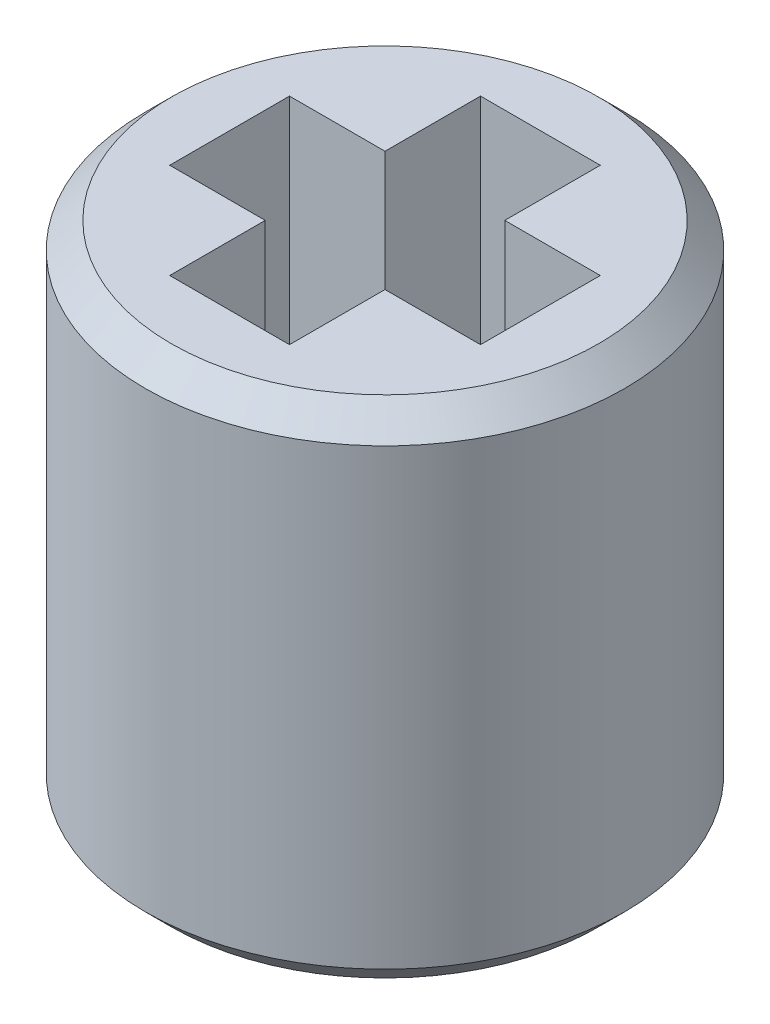
ISO-10303-21;
HEADER;
FILE_DESCRIPTION(('STEP AP214'),'2;1');
FILE_NAME('part.step','',(''),(''),'','','');
FILE_SCHEMA(('AUTOMOTIVE_DESIGN { 1 0 10303 214 1 1 1 1 }'));
ENDSEC;
DATA;
#1=APPLICATION_CONTEXT('core data for automotive mechanical design processes');
#2=APPLICATION_PROTOCOL_DEFINITION('international standard','automotive_design',2000,#1);
#3=PRODUCT_CONTEXT('',#1,'mechanical');
#4=PRODUCT('Part','Part','',(#3));
#5=PRODUCT_RELATED_PRODUCT_CATEGORY('part','',(#4));
#6=PRODUCT_DEFINITION_FORMATION('','',#4);
#7=PRODUCT_DEFINITION_CONTEXT('part definition',#1,'design');
#8=PRODUCT_DEFINITION('design','',#6,#7);
#9=PRODUCT_DEFINITION_SHAPE('','',#8);
#10=(LENGTH_UNIT() NAMED_UNIT(*) SI_UNIT(.MILLI.,.METRE.));
#11=(NAMED_UNIT(*) PLANE_ANGLE_UNIT() SI_UNIT($,.RADIAN.));
#12=(NAMED_UNIT(*) SI_UNIT($,.STERADIAN.) SOLID_ANGLE_UNIT());
#13=UNCERTAINTY_MEASURE_WITH_UNIT(LENGTH_MEASURE(1.E-05),#10,'distance_accuracy_value','');
#14=(GEOMETRIC_REPRESENTATION_CONTEXT(3) GLOBAL_UNCERTAINTY_ASSIGNED_CONTEXT((#13)) GLOBAL_UNIT_ASSIGNED_CONTEXT((#10,
#11,#12)) REPRESENTATION_CONTEXT('',''));
#15=CARTESIAN_POINT('',(0.,0.,0.));
#16=DIRECTION('',(0.,0.,1.));
#17=DIRECTION('',(1.,0.,0.));
#18=AXIS2_PLACEMENT_3D('',#15,#16,#17);
#19=CARTESIAN_POINT('',(0.,3.9,0.));
#20=DIRECTION('',(0.,-1.,0.));
#21=DIRECTION('',(0.,0.,-1.));
#22=AXIS2_PLACEMENT_3D('',#19,#20,#21);
#23=CYLINDRICAL_SURFACE('',#22,3.7);
#24=CARTESIAN_POINT('',(0.,-3.5,0.));
#25=DIRECTION('',(0.,1.,0.));
#26=DIRECTION('',(0.,0.,1.));
#27=AXIS2_PLACEMENT_3D('',#24,#25,#26);
#28=CIRCLE('',#27,3.7);
#29=CARTESIAN_POINT('',(0.,-3.5,3.7));
#30=VERTEX_POINT('',#29);
#31=EDGE_CURVE('E235',#30,#30,#28,.T.);
#32=ORIENTED_EDGE('',*,*,#31,.T.);
#33=EDGE_LOOP('',(#32));
#34=FACE_BOUND('',#33,.T.);
#35=CARTESIAN_POINT('',(0.,3.5,0.));
#36=DIRECTION('',(0.,1.,0.));
#37=DIRECTION('',(0.,0.,1.));
#38=AXIS2_PLACEMENT_3D('',#35,#36,#37);
#39=CIRCLE('',#38,3.7);
#40=CARTESIAN_POINT('',(0.,3.5,3.7));
#41=VERTEX_POINT('',#40);
#42=EDGE_CURVE('E213',#41,#41,#39,.F.);
#43=ORIENTED_EDGE('',*,*,#42,.T.);
#44=EDGE_LOOP('',(#43));
#45=FACE_BOUND('',#44,.T.);
#46=ADVANCED_FACE('F43',(#34,#45),#23,.T.);
#47=CARTESIAN_POINT('',(0.,3.9,0.));
#48=DIRECTION('',(0.,1.,0.));
#49=DIRECTION('',(0.,0.,1.));
#50=AXIS2_PLACEMENT_3D('',#47,#48,#49);
#51=PLANE('',#50);
#52=CARTESIAN_POINT('',(0.,3.9,0.));
#53=DIRECTION('',(0.,1.,0.));
#54=DIRECTION('',(0.,0.,1.));
#55=AXIS2_PLACEMENT_3D('',#52,#53,#54);
#56=CIRCLE('',#55,3.3);
#57=CARTESIAN_POINT('',(0.,3.9,3.3));
#58=VERTEX_POINT('',#57);
#59=EDGE_CURVE('E11',#58,#58,#56,.T.);
#60=ORIENTED_EDGE('',*,*,#59,.T.);
#61=EDGE_LOOP('',(#60));
#62=FACE_BOUND('',#61,.T.);
#63=DIRECTION('',(1.,0.,0.));
#64=VECTOR('',#63,1.);
#65=CARTESIAN_POINT('',(0.925,3.9,0.925));
#66=LINE('',#65,#64);
#67=CARTESIAN_POINT('',(0.925,3.9,0.925));
#68=VERTEX_POINT('',#67);
#69=CARTESIAN_POINT('',(2.4,3.9,0.925));
#70=VERTEX_POINT('',#69);
#71=EDGE_CURVE('E59',#68,#70,#66,.T.);
#72=ORIENTED_EDGE('',*,*,#71,.F.);
#73=DIRECTION('',(0.,0.,-1.));
#74=VECTOR('',#73,1.);
#75=CARTESIAN_POINT('',(0.925,3.9,0.925));
#76=LINE('',#75,#74);
#77=CARTESIAN_POINT('',(0.925,3.9,2.4));
#78=VERTEX_POINT('',#77);
#79=EDGE_CURVE('E151',#78,#68,#76,.T.);
#80=ORIENTED_EDGE('',*,*,#79,.F.);
#81=DIRECTION('',(1.,0.,0.));
#82=VECTOR('',#81,1.);
#83=CARTESIAN_POINT('',(-0.925,3.9,2.4));
#84=LINE('',#83,#82);
#85=CARTESIAN_POINT('',(-0.925,3.9,2.4));
#86=VERTEX_POINT('',#85);
#87=EDGE_CURVE('E154',#86,#78,#84,.T.);
#88=ORIENTED_EDGE('',*,*,#87,.F.);
#89=DIRECTION('',(0.,0.,1.));
#90=VECTOR('',#89,1.);
#91=CARTESIAN_POINT('',(-0.925,3.9,0.925));
#92=LINE('',#91,#90);
#93=CARTESIAN_POINT('',(-0.925,3.9,0.925));
#94=VERTEX_POINT('',#93);
#95=EDGE_CURVE('E206',#94,#86,#92,.T.);
#96=ORIENTED_EDGE('',*,*,#95,.F.);
#97=DIRECTION('',(1.,0.,0.));
#98=VECTOR('',#97,1.);
#99=CARTESIAN_POINT('',(-2.4,3.9,0.925));
#100=LINE('',#99,#98);
#101=CARTESIAN_POINT('',(-2.4,3.9,0.925));
#102=VERTEX_POINT('',#101);
#103=EDGE_CURVE('E203',#102,#94,#100,.T.);
#104=ORIENTED_EDGE('',*,*,#103,.F.);
#105=DIRECTION('',(0.,0.,1.));
#106=VECTOR('',#105,1.);
#107=CARTESIAN_POINT('',(-2.4,3.9,-0.925));
#108=LINE('',#107,#106);
#109=CARTESIAN_POINT('',(-2.4,3.9,-0.925));
#110=VERTEX_POINT('',#109);
#111=EDGE_CURVE('E200',#110,#102,#108,.T.);
#112=ORIENTED_EDGE('',*,*,#111,.F.);
#113=DIRECTION('',(-1.,0.,0.));
#114=VECTOR('',#113,1.);
#115=CARTESIAN_POINT('',(-2.4,3.9,-0.925));
#116=LINE('',#115,#114);
#117=CARTESIAN_POINT('',(-0.925,3.9,-0.925));
#118=VERTEX_POINT('',#117);
#119=EDGE_CURVE('E197',#118,#110,#116,.T.);
#120=ORIENTED_EDGE('',*,*,#119,.F.);
#121=DIRECTION('',(0.,0.,1.));
#122=VECTOR('',#121,1.);
#123=CARTESIAN_POINT('',(-0.925000000000001,3.9,-2.4));
#124=LINE('',#123,#122);
#125=CARTESIAN_POINT('',(-0.925000000000001,3.9,-2.4));
#126=VERTEX_POINT('',#125);
#127=EDGE_CURVE('E194',#126,#118,#124,.T.);
#128=ORIENTED_EDGE('',*,*,#127,.F.);
#129=DIRECTION('',(-1.,0.,0.));
#130=VECTOR('',#129,1.);
#131=CARTESIAN_POINT('',(-0.925000000000001,3.9,-2.4));
#132=LINE('',#131,#130);
#133=CARTESIAN_POINT('',(0.924999999999999,3.9,-2.4));
#134=VERTEX_POINT('',#133);
#135=EDGE_CURVE('E191',#134,#126,#132,.T.);
#136=ORIENTED_EDGE('',*,*,#135,.F.);
#137=DIRECTION('',(0.,0.,-1.));
#138=VECTOR('',#137,1.);
#139=CARTESIAN_POINT('',(0.924999999999999,3.9,-2.4));
#140=LINE('',#139,#138);
#141=CARTESIAN_POINT('',(0.924999999999999,3.9,-0.925));
#142=VERTEX_POINT('',#141);
#143=EDGE_CURVE('E188',#142,#134,#140,.T.);
#144=ORIENTED_EDGE('',*,*,#143,.F.);
#145=DIRECTION('',(-1.,0.,0.));
#146=VECTOR('',#145,1.);
#147=CARTESIAN_POINT('',(0.924999999999999,3.9,-0.925));
#148=LINE('',#147,#146);
#149=CARTESIAN_POINT('',(2.4,3.9,-0.925));
#150=VERTEX_POINT('',#149);
#151=EDGE_CURVE('E185',#150,#142,#148,.T.);
#152=ORIENTED_EDGE('',*,*,#151,.F.);
#153=DIRECTION('',(0.,0.,-1.));
#154=VECTOR('',#153,1.);
#155=CARTESIAN_POINT('',(2.4,3.9,-0.925));
#156=LINE('',#155,#154);
#157=EDGE_CURVE('E183',#70,#150,#156,.T.);
#158=ORIENTED_EDGE('',*,*,#157,.F.);
#159=EDGE_LOOP('',(#72,#80,#88,#96,#104,#112,#120,#128,#136,#144,#152,#158));
#160=FACE_BOUND('',#159,.T.);
#161=ADVANCED_FACE('F248',(#62,#160),#51,.T.);
#162=CARTESIAN_POINT('',(0.,-3.9,0.));
#163=DIRECTION('',(0.,1.,0.));
#164=DIRECTION('',(0.,0.,1.));
#165=AXIS2_PLACEMENT_3D('',#162,#163,#164);
#166=PLANE('',#165);
#167=CARTESIAN_POINT('',(0.,-3.9,0.));
#168=DIRECTION('',(0.,1.,0.));
#169=DIRECTION('',(0.,0.,1.));
#170=AXIS2_PLACEMENT_3D('',#167,#168,#169);
#171=CIRCLE('',#170,3.3);
#172=CARTESIAN_POINT('',(0.,-3.9,3.3));
#173=VERTEX_POINT('',#172);
#174=EDGE_CURVE('E52',#173,#173,#171,.F.);
#175=ORIENTED_EDGE('',*,*,#174,.T.);
#176=EDGE_LOOP('',(#175));
#177=FACE_BOUND('',#176,.T.);
#178=DIRECTION('',(0.,0.,-1.));
#179=VECTOR('',#178,1.);
#180=CARTESIAN_POINT('',(0.925,-3.9,0.925));
#181=LINE('',#180,#179);
#182=CARTESIAN_POINT('',(0.925,-3.9,2.4));
#183=VERTEX_POINT('',#182);
#184=CARTESIAN_POINT('',(0.925,-3.9,0.925));
#185=VERTEX_POINT('',#184);
#186=EDGE_CURVE('E141',#183,#185,#181,.T.);
#187=ORIENTED_EDGE('',*,*,#186,.T.);
#188=DIRECTION('',(1.,0.,0.));
#189=VECTOR('',#188,1.);
#190=CARTESIAN_POINT('',(0.925,-3.9,0.925));
#191=LINE('',#190,#189);
#192=CARTESIAN_POINT('',(2.4,-3.9,0.925));
#193=VERTEX_POINT('',#192);
#194=EDGE_CURVE('E135',#185,#193,#191,.T.);
#195=ORIENTED_EDGE('',*,*,#194,.T.);
#196=DIRECTION('',(0.,0.,-1.));
#197=VECTOR('',#196,1.);
#198=CARTESIAN_POINT('',(2.4,-3.9,-0.925));
#199=LINE('',#198,#197);
#200=CARTESIAN_POINT('',(2.4,-3.9,-0.925));
#201=VERTEX_POINT('',#200);
#202=EDGE_CURVE('E144',#193,#201,#199,.T.);
#203=ORIENTED_EDGE('',*,*,#202,.T.);
#204=DIRECTION('',(-1.,0.,0.));
#205=VECTOR('',#204,1.);
#206=CARTESIAN_POINT('',(0.924999999999999,-3.9,-0.925));
#207=LINE('',#206,#205);
#208=CARTESIAN_POINT('',(0.924999999999999,-3.9,-0.925));
#209=VERTEX_POINT('',#208);
#210=EDGE_CURVE('E67',#201,#209,#207,.T.);
#211=ORIENTED_EDGE('',*,*,#210,.T.);
#212=DIRECTION('',(0.,0.,-1.));
#213=VECTOR('',#212,1.);
#214=CARTESIAN_POINT('',(0.924999999999999,-3.9,-2.4));
#215=LINE('',#214,#213);
#216=CARTESIAN_POINT('',(0.924999999999999,-3.9,-2.4));
#217=VERTEX_POINT('',#216);
#218=EDGE_CURVE('E158',#209,#217,#215,.T.);
#219=ORIENTED_EDGE('',*,*,#218,.T.);
#220=DIRECTION('',(-1.,0.,0.));
#221=VECTOR('',#220,1.);
#222=CARTESIAN_POINT('',(-0.925000000000001,-3.9,-2.4));
#223=LINE('',#222,#221);
#224=CARTESIAN_POINT('',(-0.925000000000001,-3.9,-2.4));
#225=VERTEX_POINT('',#224);
#226=EDGE_CURVE('E161',#217,#225,#223,.T.);
#227=ORIENTED_EDGE('',*,*,#226,.T.);
#228=DIRECTION('',(0.,0.,1.));
#229=VECTOR('',#228,1.);
#230=CARTESIAN_POINT('',(-0.925000000000001,-3.9,-2.4));
#231=LINE('',#230,#229);
#232=CARTESIAN_POINT('',(-0.925,-3.9,-0.925));
#233=VERTEX_POINT('',#232);
#234=EDGE_CURVE('E164',#225,#233,#231,.T.);
#235=ORIENTED_EDGE('',*,*,#234,.T.);
#236=DIRECTION('',(-1.,0.,0.));
#237=VECTOR('',#236,1.);
#238=CARTESIAN_POINT('',(-2.4,-3.9,-0.925));
#239=LINE('',#238,#237);
#240=CARTESIAN_POINT('',(-2.4,-3.9,-0.925));
#241=VERTEX_POINT('',#240);
#242=EDGE_CURVE('E167',#233,#241,#239,.T.);
#243=ORIENTED_EDGE('',*,*,#242,.T.);
#244=DIRECTION('',(0.,0.,1.));
#245=VECTOR('',#244,1.);
#246=CARTESIAN_POINT('',(-2.4,-3.9,-0.925));
#247=LINE('',#246,#245);
#248=CARTESIAN_POINT('',(-2.4,-3.9,0.925));
#249=VERTEX_POINT('',#248);
#250=EDGE_CURVE('E170',#241,#249,#247,.T.);
#251=ORIENTED_EDGE('',*,*,#250,.T.);
#252=DIRECTION('',(1.,0.,0.));
#253=VECTOR('',#252,1.);
#254=CARTESIAN_POINT('',(-2.4,-3.9,0.925));
#255=LINE('',#254,#253);
#256=CARTESIAN_POINT('',(-0.925,-3.9,0.925));
#257=VERTEX_POINT('',#256);
#258=EDGE_CURVE('E173',#249,#257,#255,.T.);
#259=ORIENTED_EDGE('',*,*,#258,.T.);
#260=DIRECTION('',(0.,0.,1.));
#261=VECTOR('',#260,1.);
#262=CARTESIAN_POINT('',(-0.925,-3.9,0.925));
#263=LINE('',#262,#261);
#264=CARTESIAN_POINT('',(-0.925,-3.9,2.4));
#265=VERTEX_POINT('',#264);
#266=EDGE_CURVE('E176',#257,#265,#263,.T.);
#267=ORIENTED_EDGE('',*,*,#266,.T.);
#268=DIRECTION('',(1.,0.,0.));
#269=VECTOR('',#268,1.);
#270=CARTESIAN_POINT('',(-0.925,-3.9,2.4));
#271=LINE('',#270,#269);
#272=EDGE_CURVE('E179',#265,#183,#271,.T.);
#273=ORIENTED_EDGE('',*,*,#272,.T.);
#274=EDGE_LOOP('',(#187,#195,#203,#211,#219,#227,#235,#243,#251,#259,#267,#273));
#275=FACE_BOUND('',#274,.T.);
#276=ADVANCED_FACE('F148',(#177,#275),#166,.F.);
#277=CARTESIAN_POINT('',(0.925,-3.9,0.925));
#278=DIRECTION('',(0.,0.,1.));
#279=DIRECTION('',(1.,0.,0.));
#280=AXIS2_PLACEMENT_3D('',#277,#278,#279);
#281=PLANE('',#280);
#282=ORIENTED_EDGE('',*,*,#71,.T.);
#283=DIRECTION('',(0.,1.,0.));
#284=VECTOR('',#283,1.);
#285=CARTESIAN_POINT('',(2.4,-3.9,0.925));
#286=LINE('',#285,#284);
#287=EDGE_CURVE('E131',#193,#70,#286,.T.);
#288=ORIENTED_EDGE('',*,*,#287,.F.);
#289=ORIENTED_EDGE('',*,*,#194,.F.);
#290=DIRECTION('',(0.,1.,0.));
#291=VECTOR('',#290,1.);
#292=CARTESIAN_POINT('',(0.925,-3.9,0.925));
#293=LINE('',#292,#291);
#294=EDGE_CURVE('E211',#185,#68,#293,.T.);
#295=ORIENTED_EDGE('',*,*,#294,.T.);
#296=EDGE_LOOP('',(#282,#288,#289,#295));
#297=FACE_BOUND('',#296,.T.);
#298=ADVANCED_FACE('F133',(#297),#281,.F.);
#299=CARTESIAN_POINT('',(0.925,-3.9,0.925));
#300=DIRECTION('',(1.,0.,0.));
#301=DIRECTION('',(0.,0.,-1.));
#302=AXIS2_PLACEMENT_3D('',#299,#300,#301);
#303=PLANE('',#302);
#304=ORIENTED_EDGE('',*,*,#79,.T.);
#305=ORIENTED_EDGE('',*,*,#294,.F.);
#306=ORIENTED_EDGE('',*,*,#186,.F.);
#307=DIRECTION('',(0.,1.,0.));
#308=VECTOR('',#307,1.);
#309=CARTESIAN_POINT('',(0.925,-3.9,2.4));
#310=LINE('',#309,#308);
#311=EDGE_CURVE('E214',#183,#78,#310,.T.);
#312=ORIENTED_EDGE('',*,*,#311,.T.);
#313=EDGE_LOOP('',(#304,#305,#306,#312));
#314=FACE_BOUND('',#313,.T.);
#315=ADVANCED_FACE('F295',(#314),#303,.F.);
#316=CARTESIAN_POINT('',(-0.925,-3.9,2.4));
#317=DIRECTION('',(0.,0.,1.));
#318=DIRECTION('',(1.,0.,0.));
#319=AXIS2_PLACEMENT_3D('',#316,#317,#318);
#320=PLANE('',#319);
#321=ORIENTED_EDGE('',*,*,#87,.T.);
#322=ORIENTED_EDGE('',*,*,#311,.F.);
#323=ORIENTED_EDGE('',*,*,#272,.F.);
#324=DIRECTION('',(0.,1.,0.));
#325=VECTOR('',#324,1.);
#326=CARTESIAN_POINT('',(-0.925,-3.9,2.4));
#327=LINE('',#326,#325);
#328=EDGE_CURVE('E216',#265,#86,#327,.T.);
#329=ORIENTED_EDGE('',*,*,#328,.T.);
#330=EDGE_LOOP('',(#321,#322,#323,#329));
#331=FACE_BOUND('',#330,.T.);
#332=ADVANCED_FACE('F293',(#331),#320,.F.);
#333=CARTESIAN_POINT('',(-0.925,-3.9,0.925));
#334=DIRECTION('',(-1.,0.,0.));
#335=DIRECTION('',(0.,0.,1.));
#336=AXIS2_PLACEMENT_3D('',#333,#334,#335);
#337=PLANE('',#336);
#338=ORIENTED_EDGE('',*,*,#95,.T.);
#339=ORIENTED_EDGE('',*,*,#328,.F.);
#340=ORIENTED_EDGE('',*,*,#266,.F.);
#341=DIRECTION('',(0.,1.,0.));
#342=VECTOR('',#341,1.);
#343=CARTESIAN_POINT('',(-0.925,-3.9,0.925));
#344=LINE('',#343,#342);
#345=EDGE_CURVE('E218',#257,#94,#344,.T.);
#346=ORIENTED_EDGE('',*,*,#345,.T.);
#347=EDGE_LOOP('',(#338,#339,#340,#346));
#348=FACE_BOUND('',#347,.T.);
#349=ADVANCED_FACE('F290',(#348),#337,.F.);
#350=CARTESIAN_POINT('',(-2.4,-3.9,0.925));
#351=DIRECTION('',(0.,0.,1.));
#352=DIRECTION('',(1.,0.,0.));
#353=AXIS2_PLACEMENT_3D('',#350,#351,#352);
#354=PLANE('',#353);
#355=ORIENTED_EDGE('',*,*,#103,.T.);
#356=ORIENTED_EDGE('',*,*,#345,.F.);
#357=ORIENTED_EDGE('',*,*,#258,.F.);
#358=DIRECTION('',(0.,1.,0.));
#359=VECTOR('',#358,1.);
#360=CARTESIAN_POINT('',(-2.4,-3.9,0.925));
#361=LINE('',#360,#359);
#362=EDGE_CURVE('E220',#249,#102,#361,.T.);
#363=ORIENTED_EDGE('',*,*,#362,.T.);
#364=EDGE_LOOP('',(#355,#356,#357,#363));
#365=FACE_BOUND('',#364,.T.);
#366=ADVANCED_FACE('F286',(#365),#354,.F.);
#367=CARTESIAN_POINT('',(-2.4,-3.9,-0.925));
#368=DIRECTION('',(-1.,0.,0.));
#369=DIRECTION('',(0.,0.,1.));
#370=AXIS2_PLACEMENT_3D('',#367,#368,#369);
#371=PLANE('',#370);
#372=ORIENTED_EDGE('',*,*,#111,.T.);
#373=ORIENTED_EDGE('',*,*,#362,.F.);
#374=ORIENTED_EDGE('',*,*,#250,.F.);
#375=DIRECTION('',(0.,1.,0.));
#376=VECTOR('',#375,1.);
#377=CARTESIAN_POINT('',(-2.4,-3.9,-0.925));
#378=LINE('',#377,#376);
#379=EDGE_CURVE('E222',#241,#110,#378,.T.);
#380=ORIENTED_EDGE('',*,*,#379,.T.);
#381=EDGE_LOOP('',(#372,#373,#374,#380));
#382=FACE_BOUND('',#381,.T.);
#383=ADVANCED_FACE('F282',(#382),#371,.F.);
#384=CARTESIAN_POINT('',(-2.4,-3.9,-0.925));
#385=DIRECTION('',(0.,0.,-1.));
#386=DIRECTION('',(-1.,0.,0.));
#387=AXIS2_PLACEMENT_3D('',#384,#385,#386);
#388=PLANE('',#387);
#389=ORIENTED_EDGE('',*,*,#119,.T.);
#390=ORIENTED_EDGE('',*,*,#379,.F.);
#391=ORIENTED_EDGE('',*,*,#242,.F.);
#392=DIRECTION('',(0.,1.,0.));
#393=VECTOR('',#392,1.);
#394=CARTESIAN_POINT('',(-0.925,-3.9,-0.925));
#395=LINE('',#394,#393);
#396=EDGE_CURVE('E224',#233,#118,#395,.T.);
#397=ORIENTED_EDGE('',*,*,#396,.T.);
#398=EDGE_LOOP('',(#389,#390,#391,#397));
#399=FACE_BOUND('',#398,.T.);
#400=ADVANCED_FACE('F278',(#399),#388,.F.);
#401=CARTESIAN_POINT('',(-0.925000000000001,-3.9,-2.4));
#402=DIRECTION('',(-1.,0.,0.));
#403=DIRECTION('',(0.,0.,1.));
#404=AXIS2_PLACEMENT_3D('',#401,#402,#403);
#405=PLANE('',#404);
#406=ORIENTED_EDGE('',*,*,#127,.T.);
#407=ORIENTED_EDGE('',*,*,#396,.F.);
#408=ORIENTED_EDGE('',*,*,#234,.F.);
#409=DIRECTION('',(0.,1.,0.));
#410=VECTOR('',#409,1.);
#411=CARTESIAN_POINT('',(-0.925000000000001,-3.9,-2.4));
#412=LINE('',#411,#410);
#413=EDGE_CURVE('E226',#225,#126,#412,.T.);
#414=ORIENTED_EDGE('',*,*,#413,.T.);
#415=EDGE_LOOP('',(#406,#407,#408,#414));
#416=FACE_BOUND('',#415,.T.);
#417=ADVANCED_FACE('F274',(#416),#405,.F.);
#418=CARTESIAN_POINT('',(-0.925000000000001,-3.9,-2.4));
#419=DIRECTION('',(0.,0.,-1.));
#420=DIRECTION('',(-1.,0.,0.));
#421=AXIS2_PLACEMENT_3D('',#418,#419,#420);
#422=PLANE('',#421);
#423=ORIENTED_EDGE('',*,*,#135,.T.);
#424=ORIENTED_EDGE('',*,*,#413,.F.);
#425=ORIENTED_EDGE('',*,*,#226,.F.);
#426=DIRECTION('',(0.,1.,0.));
#427=VECTOR('',#426,1.);
#428=CARTESIAN_POINT('',(0.924999999999999,-3.9,-2.4));
#429=LINE('',#428,#427);
#430=EDGE_CURVE('E228',#217,#134,#429,.T.);
#431=ORIENTED_EDGE('',*,*,#430,.T.);
#432=EDGE_LOOP('',(#423,#424,#425,#431));
#433=FACE_BOUND('',#432,.T.);
#434=ADVANCED_FACE('F271',(#433),#422,.F.);
#435=CARTESIAN_POINT('',(0.924999999999999,-3.9,-2.4));
#436=DIRECTION('',(1.,0.,0.));
#437=DIRECTION('',(0.,0.,-1.));
#438=AXIS2_PLACEMENT_3D('',#435,#436,#437);
#439=PLANE('',#438);
#440=ORIENTED_EDGE('',*,*,#143,.T.);
#441=ORIENTED_EDGE('',*,*,#430,.F.);
#442=ORIENTED_EDGE('',*,*,#218,.F.);
#443=DIRECTION('',(0.,1.,0.));
#444=VECTOR('',#443,1.);
#445=CARTESIAN_POINT('',(0.924999999999999,-3.9,-0.925));
#446=LINE('',#445,#444);
#447=EDGE_CURVE('E230',#209,#142,#446,.T.);
#448=ORIENTED_EDGE('',*,*,#447,.T.);
#449=EDGE_LOOP('',(#440,#441,#442,#448));
#450=FACE_BOUND('',#449,.T.);
#451=ADVANCED_FACE('F267',(#450),#439,.F.);
#452=CARTESIAN_POINT('',(0.924999999999999,-3.9,-0.925));
#453=DIRECTION('',(0.,0.,-1.));
#454=DIRECTION('',(-1.,0.,0.));
#455=AXIS2_PLACEMENT_3D('',#452,#453,#454);
#456=PLANE('',#455);
#457=ORIENTED_EDGE('',*,*,#151,.T.);
#458=ORIENTED_EDGE('',*,*,#447,.F.);
#459=ORIENTED_EDGE('',*,*,#210,.F.);
#460=DIRECTION('',(0.,1.,0.));
#461=VECTOR('',#460,1.);
#462=CARTESIAN_POINT('',(2.4,-3.9,-0.925));
#463=LINE('',#462,#461);
#464=EDGE_CURVE('E140',#201,#150,#463,.T.);
#465=ORIENTED_EDGE('',*,*,#464,.T.);
#466=EDGE_LOOP('',(#457,#458,#459,#465));
#467=FACE_BOUND('',#466,.T.);
#468=ADVANCED_FACE('F264',(#467),#456,.F.);
#469=CARTESIAN_POINT('',(2.4,-3.9,-0.925));
#470=DIRECTION('',(1.,0.,0.));
#471=DIRECTION('',(0.,0.,-1.));
#472=AXIS2_PLACEMENT_3D('',#469,#470,#471);
#473=PLANE('',#472);
#474=ORIENTED_EDGE('',*,*,#157,.T.);
#475=ORIENTED_EDGE('',*,*,#464,.F.);
#476=ORIENTED_EDGE('',*,*,#202,.F.);
#477=ORIENTED_EDGE('',*,*,#287,.T.);
#478=EDGE_LOOP('',(#474,#475,#476,#477));
#479=FACE_BOUND('',#478,.T.);
#480=ADVANCED_FACE('F145',(#479),#473,.F.);
#481=CARTESIAN_POINT('',(0.,-3.5,0.));
#482=DIRECTION('',(0.,1.,0.));
#483=DIRECTION('',(0.,0.,1.));
#484=AXIS2_PLACEMENT_3D('',#481,#482,#483);
#485=CONICAL_SURFACE('',#484,3.7,0.785398163397448);
#486=ORIENTED_EDGE('',*,*,#174,.F.);
#487=EDGE_LOOP('',(#486));
#488=FACE_BOUND('',#487,.T.);
#489=ORIENTED_EDGE('',*,*,#31,.F.);
#490=EDGE_LOOP('',(#489));
#491=FACE_BOUND('',#490,.T.);
#492=ADVANCED_FACE('F241',(#488,#491),#485,.T.);
#493=CARTESIAN_POINT('',(0.,3.9,0.));
#494=DIRECTION('',(0.,-1.,0.));
#495=DIRECTION('',(0.,0.,-1.));
#496=AXIS2_PLACEMENT_3D('',#493,#494,#495);
#497=CONICAL_SURFACE('',#496,3.3,0.785398163397448);
#498=ORIENTED_EDGE('',*,*,#42,.F.);
#499=EDGE_LOOP('',(#498));
#500=FACE_BOUND('',#499,.T.);
#501=ORIENTED_EDGE('',*,*,#59,.F.);
#502=EDGE_LOOP('',(#501));
#503=FACE_BOUND('',#502,.T.);
#504=ADVANCED_FACE('F46',(#500,#503),#497,.T.);
#505=CLOSED_SHELL('',(#46,#161,#276,#298,#315,#332,#349,#366,#383,#400,#417,#434,#451,#468,#480,
#492,#504));
#506=MANIFOLD_SOLID_BREP('B2',#505);
#507=ADVANCED_BREP_SHAPE_REPRESENTATION('',(#18,#506),#14);
#508=SHAPE_DEFINITION_REPRESENTATION(#9,#507);
ENDSEC;
END-ISO-10303-21;
